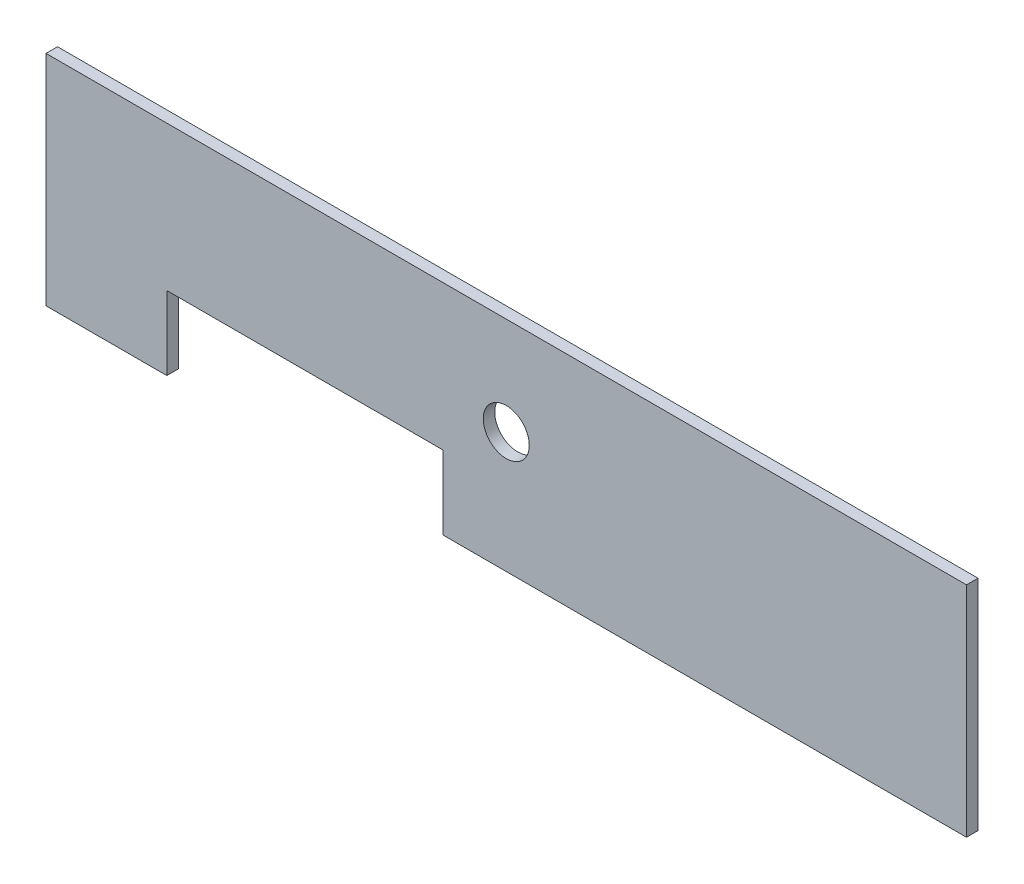
ISO-10303-21;
HEADER;
FILE_DESCRIPTION(('STEP AP214'),'2;1');
FILE_NAME('part.step','',(''),(''),'','','');
FILE_SCHEMA(('AUTOMOTIVE_DESIGN { 1 0 10303 214 1 1 1 1 }'));
ENDSEC;
DATA;
#1=APPLICATION_CONTEXT('core data for automotive mechanical design processes');
#2=APPLICATION_PROTOCOL_DEFINITION('international standard','automotive_design',2000,#1);
#3=PRODUCT_CONTEXT('',#1,'mechanical');
#4=PRODUCT('Part','Part','',(#3));
#5=PRODUCT_RELATED_PRODUCT_CATEGORY('part','',(#4));
#6=PRODUCT_DEFINITION_FORMATION('','',#4);
#7=PRODUCT_DEFINITION_CONTEXT('part definition',#1,'design');
#8=PRODUCT_DEFINITION('design','',#6,#7);
#9=PRODUCT_DEFINITION_SHAPE('','',#8);
#10=(LENGTH_UNIT() NAMED_UNIT(*) SI_UNIT(.MILLI.,.METRE.));
#11=(NAMED_UNIT(*) PLANE_ANGLE_UNIT() SI_UNIT($,.RADIAN.));
#12=(NAMED_UNIT(*) SI_UNIT($,.STERADIAN.) SOLID_ANGLE_UNIT());
#13=UNCERTAINTY_MEASURE_WITH_UNIT(LENGTH_MEASURE(1.E-05),#10,'distance_accuracy_value','');
#14=(GEOMETRIC_REPRESENTATION_CONTEXT(3) GLOBAL_UNCERTAINTY_ASSIGNED_CONTEXT((#13)) GLOBAL_UNIT_ASSIGNED_CONTEXT((#10,
#11,#12)) REPRESENTATION_CONTEXT('',''));
#15=CARTESIAN_POINT('',(0.,0.,0.));
#16=DIRECTION('',(0.,0.,1.));
#17=DIRECTION('',(1.,0.,0.));
#18=AXIS2_PLACEMENT_3D('',#15,#16,#17);
#19=CARTESIAN_POINT('',(-255.102040816327,148.567224711269,5.));
#20=DIRECTION('',(1.,0.,0.));
#21=DIRECTION('',(0.,1.,0.));
#22=AXIS2_PLACEMENT_3D('',#19,#20,#21);
#23=PLANE('',#22);
#24=DIRECTION('',(0.,-1.,0.));
#25=VECTOR('',#24,1.);
#26=CARTESIAN_POINT('',(-255.102040816327,148.567224711269,0.));
#27=LINE('',#26,#25);
#28=CARTESIAN_POINT('',(-255.102040816327,148.567224711269,0.));
#29=VERTEX_POINT('',#28);
#30=CARTESIAN_POINT('',(-255.102040816327,53.5672247112689,0.));
#31=VERTEX_POINT('',#30);
#32=EDGE_CURVE('E145',#29,#31,#27,.T.);
#33=ORIENTED_EDGE('',*,*,#32,.T.);
#34=DIRECTION('',(0.,0.,-1.));
#35=VECTOR('',#34,1.);
#36=CARTESIAN_POINT('',(-255.102040816327,53.5672247112689,5.));
#37=LINE('',#36,#35);
#38=CARTESIAN_POINT('',(-255.102040816327,53.5672247112689,5.));
#39=VERTEX_POINT('',#38);
#40=EDGE_CURVE('E11',#39,#31,#37,.T.);
#41=ORIENTED_EDGE('',*,*,#40,.F.);
#42=DIRECTION('',(0.,-1.,0.));
#43=VECTOR('',#42,1.);
#44=CARTESIAN_POINT('',(-255.102040816327,148.567224711269,5.));
#45=LINE('',#44,#43);
#46=CARTESIAN_POINT('',(-255.102040816327,148.567224711269,5.));
#47=VERTEX_POINT('',#46);
#48=EDGE_CURVE('E160',#47,#39,#45,.T.);
#49=ORIENTED_EDGE('',*,*,#48,.F.);
#50=DIRECTION('',(0.,0.,-1.));
#51=VECTOR('',#50,1.);
#52=CARTESIAN_POINT('',(-255.102040816327,148.567224711269,5.));
#53=LINE('',#52,#51);
#54=EDGE_CURVE('E141',#47,#29,#53,.T.);
#55=ORIENTED_EDGE('',*,*,#54,.T.);
#56=EDGE_LOOP('',(#33,#41,#49,#55));
#57=FACE_BOUND('',#56,.T.);
#58=ADVANCED_FACE('F49',(#57),#23,.F.);
#59=CARTESIAN_POINT('',(-255.102040816327,53.5672247112689,5.));
#60=DIRECTION('',(0.,1.,0.));
#61=DIRECTION('',(-1.,0.,0.));
#62=AXIS2_PLACEMENT_3D('',#59,#60,#61);
#63=PLANE('',#62);
#64=DIRECTION('',(1.,0.,0.));
#65=VECTOR('',#64,1.);
#66=CARTESIAN_POINT('',(-255.102040816327,53.5672247112689,0.));
#67=LINE('',#66,#65);
#68=CARTESIAN_POINT('',(-202.602040816327,53.567224711269,0.));
#69=VERTEX_POINT('',#68);
#70=EDGE_CURVE('E148',#31,#69,#67,.T.);
#71=ORIENTED_EDGE('',*,*,#70,.T.);
#72=DIRECTION('',(0.,0.,-1.));
#73=VECTOR('',#72,1.);
#74=CARTESIAN_POINT('',(-202.602040816327,53.567224711269,5.));
#75=LINE('',#74,#73);
#76=CARTESIAN_POINT('',(-202.602040816327,53.567224711269,5.));
#77=VERTEX_POINT('',#76);
#78=EDGE_CURVE('E58',#77,#69,#75,.T.);
#79=ORIENTED_EDGE('',*,*,#78,.F.);
#80=DIRECTION('',(1.,0.,0.));
#81=VECTOR('',#80,1.);
#82=CARTESIAN_POINT('',(-255.102040816327,53.5672247112689,5.));
#83=LINE('',#82,#81);
#84=EDGE_CURVE('E109',#39,#77,#83,.T.);
#85=ORIENTED_EDGE('',*,*,#84,.F.);
#86=ORIENTED_EDGE('',*,*,#40,.T.);
#87=EDGE_LOOP('',(#71,#79,#85,#86));
#88=FACE_BOUND('',#87,.T.);
#89=ADVANCED_FACE('F211',(#88),#63,.F.);
#90=CARTESIAN_POINT('',(-202.602040816326,85.5672247112689,5.));
#91=DIRECTION('',(-1.,0.,0.));
#92=DIRECTION('',(0.,-1.,0.));
#93=AXIS2_PLACEMENT_3D('',#90,#91,#92);
#94=PLANE('',#93);
#95=DIRECTION('',(0.,1.,0.));
#96=VECTOR('',#95,1.);
#97=CARTESIAN_POINT('',(-202.602040816326,85.5672247112689,0.));
#98=LINE('',#97,#96);
#99=CARTESIAN_POINT('',(-202.602040816326,85.5672247112689,0.));
#100=VERTEX_POINT('',#99);
#101=EDGE_CURVE('E150',#69,#100,#98,.T.);
#102=ORIENTED_EDGE('',*,*,#101,.T.);
#103=DIRECTION('',(0.,0.,-1.));
#104=VECTOR('',#103,1.);
#105=CARTESIAN_POINT('',(-202.602040816326,85.5672247112689,5.));
#106=LINE('',#105,#104);
#107=CARTESIAN_POINT('',(-202.602040816326,85.5672247112689,5.));
#108=VERTEX_POINT('',#107);
#109=EDGE_CURVE('E167',#108,#100,#106,.T.);
#110=ORIENTED_EDGE('',*,*,#109,.F.);
#111=DIRECTION('',(0.,1.,0.));
#112=VECTOR('',#111,1.);
#113=CARTESIAN_POINT('',(-202.602040816326,85.5672247112689,5.));
#114=LINE('',#113,#112);
#115=EDGE_CURVE('E176',#77,#108,#114,.T.);
#116=ORIENTED_EDGE('',*,*,#115,.F.);
#117=ORIENTED_EDGE('',*,*,#78,.T.);
#118=EDGE_LOOP('',(#102,#110,#116,#117));
#119=FACE_BOUND('',#118,.T.);
#120=ADVANCED_FACE('F174',(#119),#94,.F.);
#121=CARTESIAN_POINT('',(-82.6020408163265,85.5672247112689,5.));
#122=DIRECTION('',(0.,1.,0.));
#123=DIRECTION('',(-1.,0.,0.));
#124=AXIS2_PLACEMENT_3D('',#121,#122,#123);
#125=PLANE('',#124);
#126=DIRECTION('',(1.,0.,0.));
#127=VECTOR('',#126,1.);
#128=CARTESIAN_POINT('',(-82.6020408163265,85.5672247112689,0.));
#129=LINE('',#128,#127);
#130=CARTESIAN_POINT('',(-82.6020408163265,85.5672247112689,0.));
#131=VERTEX_POINT('',#130);
#132=EDGE_CURVE('E152',#100,#131,#129,.T.);
#133=ORIENTED_EDGE('',*,*,#132,.T.);
#134=DIRECTION('',(0.,0.,-1.));
#135=VECTOR('',#134,1.);
#136=CARTESIAN_POINT('',(-82.6020408163265,85.5672247112689,5.));
#137=LINE('',#136,#135);
#138=CARTESIAN_POINT('',(-82.6020408163265,85.5672247112689,5.));
#139=VERTEX_POINT('',#138);
#140=EDGE_CURVE('E164',#139,#131,#137,.T.);
#141=ORIENTED_EDGE('',*,*,#140,.F.);
#142=DIRECTION('',(1.,0.,0.));
#143=VECTOR('',#142,1.);
#144=CARTESIAN_POINT('',(-82.6020408163265,85.5672247112689,5.));
#145=LINE('',#144,#143);
#146=EDGE_CURVE('E188',#108,#139,#145,.T.);
#147=ORIENTED_EDGE('',*,*,#146,.F.);
#148=ORIENTED_EDGE('',*,*,#109,.T.);
#149=EDGE_LOOP('',(#133,#141,#147,#148));
#150=FACE_BOUND('',#149,.T.);
#151=ADVANCED_FACE('F184',(#150),#125,.F.);
#152=CARTESIAN_POINT('',(-82.6020408163265,85.5672247112689,5.));
#153=DIRECTION('',(1.,0.,0.));
#154=DIRECTION('',(0.,1.,0.));
#155=AXIS2_PLACEMENT_3D('',#152,#153,#154);
#156=PLANE('',#155);
#157=DIRECTION('',(0.,-1.,0.));
#158=VECTOR('',#157,1.);
#159=CARTESIAN_POINT('',(-82.6020408163265,85.5672247112689,0.));
#160=LINE('',#159,#158);
#161=CARTESIAN_POINT('',(-82.6020408163266,53.567224711269,0.));
#162=VERTEX_POINT('',#161);
#163=EDGE_CURVE('E154',#131,#162,#160,.T.);
#164=ORIENTED_EDGE('',*,*,#163,.T.);
#165=DIRECTION('',(0.,0.,-1.));
#166=VECTOR('',#165,1.);
#167=CARTESIAN_POINT('',(-82.6020408163266,53.567224711269,5.));
#168=LINE('',#167,#166);
#169=CARTESIAN_POINT('',(-82.6020408163266,53.567224711269,5.));
#170=VERTEX_POINT('',#169);
#171=EDGE_CURVE('E136',#170,#162,#168,.T.);
#172=ORIENTED_EDGE('',*,*,#171,.F.);
#173=DIRECTION('',(0.,-1.,0.));
#174=VECTOR('',#173,1.);
#175=CARTESIAN_POINT('',(-82.6020408163265,85.5672247112689,5.));
#176=LINE('',#175,#174);
#177=EDGE_CURVE('E128',#139,#170,#176,.T.);
#178=ORIENTED_EDGE('',*,*,#177,.F.);
#179=ORIENTED_EDGE('',*,*,#140,.T.);
#180=EDGE_LOOP('',(#164,#172,#178,#179));
#181=FACE_BOUND('',#180,.T.);
#182=ADVANCED_FACE('F187',(#181),#156,.F.);
#183=CARTESIAN_POINT('',(92.3979591836735,53.5672247112689,5.));
#184=DIRECTION('',(0.,1.,0.));
#185=DIRECTION('',(0.,0.,1.));
#186=AXIS2_PLACEMENT_3D('',#183,#184,#185);
#187=PLANE('',#186);
#188=DIRECTION('',(1.,0.,0.));
#189=VECTOR('',#188,1.);
#190=CARTESIAN_POINT('',(92.3979591836735,53.5672247112689,0.));
#191=LINE('',#190,#189);
#192=CARTESIAN_POINT('',(144.897959183673,53.5672247112689,0.));
#193=VERTEX_POINT('',#192);
#194=EDGE_CURVE('E135',#162,#193,#191,.T.);
#195=ORIENTED_EDGE('',*,*,#194,.T.);
#196=DIRECTION('',(0.,0.,-1.));
#197=VECTOR('',#196,1.);
#198=CARTESIAN_POINT('',(144.897959183673,53.5672247112689,5.));
#199=LINE('',#198,#197);
#200=CARTESIAN_POINT('',(144.897959183673,53.5672247112689,5.));
#201=VERTEX_POINT('',#200);
#202=EDGE_CURVE('E133',#201,#193,#199,.T.);
#203=ORIENTED_EDGE('',*,*,#202,.F.);
#204=DIRECTION('',(1.,0.,0.));
#205=VECTOR('',#204,1.);
#206=CARTESIAN_POINT('',(-82.6020408163266,53.567224711269,5.));
#207=LINE('',#206,#205);
#208=EDGE_CURVE('E122',#170,#201,#207,.T.);
#209=ORIENTED_EDGE('',*,*,#208,.F.);
#210=ORIENTED_EDGE('',*,*,#171,.T.);
#211=EDGE_LOOP('',(#195,#203,#209,#210));
#212=FACE_BOUND('',#211,.T.);
#213=ADVANCED_FACE('F134',(#212),#187,.F.);
#214=CARTESIAN_POINT('',(144.897959183673,148.567224711269,5.));
#215=DIRECTION('',(-1.,0.,0.));
#216=DIRECTION('',(0.,0.,1.));
#217=AXIS2_PLACEMENT_3D('',#214,#215,#216);
#218=PLANE('',#217);
#219=DIRECTION('',(0.,1.,0.));
#220=VECTOR('',#219,1.);
#221=CARTESIAN_POINT('',(144.897959183673,148.567224711269,0.));
#222=LINE('',#221,#220);
#223=CARTESIAN_POINT('',(144.897959183673,148.567224711269,0.));
#224=VERTEX_POINT('',#223);
#225=EDGE_CURVE('E95',#193,#224,#222,.T.);
#226=ORIENTED_EDGE('',*,*,#225,.T.);
#227=DIRECTION('',(0.,0.,-1.));
#228=VECTOR('',#227,1.);
#229=CARTESIAN_POINT('',(144.897959183673,148.567224711269,5.));
#230=LINE('',#229,#228);
#231=CARTESIAN_POINT('',(144.897959183673,148.567224711269,5.));
#232=VERTEX_POINT('',#231);
#233=EDGE_CURVE('E137',#232,#224,#230,.T.);
#234=ORIENTED_EDGE('',*,*,#233,.F.);
#235=DIRECTION('',(0.,1.,0.));
#236=VECTOR('',#235,1.);
#237=CARTESIAN_POINT('',(144.897959183673,148.567224711269,5.));
#238=LINE('',#237,#236);
#239=EDGE_CURVE('E126',#201,#232,#238,.T.);
#240=ORIENTED_EDGE('',*,*,#239,.F.);
#241=ORIENTED_EDGE('',*,*,#202,.T.);
#242=EDGE_LOOP('',(#226,#234,#240,#241));
#243=FACE_BOUND('',#242,.T.);
#244=ADVANCED_FACE('F139',(#243),#218,.F.);
#245=CARTESIAN_POINT('',(-255.102040816327,148.567224711269,5.));
#246=DIRECTION('',(0.,-1.,0.));
#247=DIRECTION('',(0.,0.,-1.));
#248=AXIS2_PLACEMENT_3D('',#245,#246,#247);
#249=PLANE('',#248);
#250=DIRECTION('',(-1.,0.,0.));
#251=VECTOR('',#250,1.);
#252=CARTESIAN_POINT('',(-255.102040816327,148.567224711269,0.));
#253=LINE('',#252,#251);
#254=EDGE_CURVE('E101',#224,#29,#253,.T.);
#255=ORIENTED_EDGE('',*,*,#254,.T.);
#256=ORIENTED_EDGE('',*,*,#54,.F.);
#257=DIRECTION('',(-1.,0.,0.));
#258=VECTOR('',#257,1.);
#259=CARTESIAN_POINT('',(-255.102040816327,148.567224711269,5.));
#260=LINE('',#259,#258);
#261=EDGE_CURVE('E66',#232,#47,#260,.T.);
#262=ORIENTED_EDGE('',*,*,#261,.F.);
#263=ORIENTED_EDGE('',*,*,#233,.T.);
#264=EDGE_LOOP('',(#255,#256,#262,#263));
#265=FACE_BOUND('',#264,.T.);
#266=ADVANCED_FACE('F218',(#265),#249,.F.);
#267=CARTESIAN_POINT('',(0.,0.,5.));
#268=DIRECTION('',(0.,0.,1.));
#269=DIRECTION('',(1.,0.,0.));
#270=AXIS2_PLACEMENT_3D('',#267,#268,#269);
#271=PLANE('',#270);
#272=CARTESIAN_POINT('',(-55.1020408163265,106.067224711269,5.));
#273=DIRECTION('',(0.,0.,1.));
#274=DIRECTION('',(1.,0.,0.));
#275=AXIS2_PLACEMENT_3D('',#272,#273,#274);
#276=CIRCLE('',#275,10.);
#277=CARTESIAN_POINT('',(-45.1020408163265,106.067224711269,5.));
#278=VERTEX_POINT('',#277);
#279=EDGE_CURVE('E194',#278,#278,#276,.T.);
#280=ORIENTED_EDGE('',*,*,#279,.F.);
#281=EDGE_LOOP('',(#280));
#282=FACE_BOUND('',#281,.T.);
#283=ORIENTED_EDGE('',*,*,#48,.T.);
#284=ORIENTED_EDGE('',*,*,#84,.T.);
#285=ORIENTED_EDGE('',*,*,#115,.T.);
#286=ORIENTED_EDGE('',*,*,#146,.T.);
#287=ORIENTED_EDGE('',*,*,#177,.T.);
#288=ORIENTED_EDGE('',*,*,#208,.T.);
#289=ORIENTED_EDGE('',*,*,#239,.T.);
#290=ORIENTED_EDGE('',*,*,#261,.T.);
#291=EDGE_LOOP('',(#283,#284,#285,#286,#287,#288,#289,#290));
#292=FACE_BOUND('',#291,.T.);
#293=ADVANCED_FACE('F124',(#282,#292),#271,.T.);
#294=CARTESIAN_POINT('',(0.,0.,0.));
#295=DIRECTION('',(0.,0.,1.));
#296=DIRECTION('',(1.,0.,0.));
#297=AXIS2_PLACEMENT_3D('',#294,#295,#296);
#298=PLANE('',#297);
#299=CARTESIAN_POINT('',(-55.1020408163265,106.067224711269,0.));
#300=DIRECTION('',(0.,0.,1.));
#301=DIRECTION('',(1.,0.,0.));
#302=AXIS2_PLACEMENT_3D('',#299,#300,#301);
#303=CIRCLE('',#302,10.);
#304=CARTESIAN_POINT('',(-45.1020408163265,106.067224711269,0.));
#305=VERTEX_POINT('',#304);
#306=EDGE_CURVE('E52',#305,#305,#303,.T.);
#307=ORIENTED_EDGE('',*,*,#306,.T.);
#308=EDGE_LOOP('',(#307));
#309=FACE_BOUND('',#308,.T.);
#310=ORIENTED_EDGE('',*,*,#32,.F.);
#311=ORIENTED_EDGE('',*,*,#254,.F.);
#312=ORIENTED_EDGE('',*,*,#225,.F.);
#313=ORIENTED_EDGE('',*,*,#194,.F.);
#314=ORIENTED_EDGE('',*,*,#163,.F.);
#315=ORIENTED_EDGE('',*,*,#132,.F.);
#316=ORIENTED_EDGE('',*,*,#101,.F.);
#317=ORIENTED_EDGE('',*,*,#70,.F.);
#318=EDGE_LOOP('',(#310,#311,#312,#313,#314,#315,#316,#317));
#319=FACE_BOUND('',#318,.T.);
#320=ADVANCED_FACE('F180',(#309,#319),#298,.F.);
#321=CARTESIAN_POINT('',(-55.1020408163265,106.067224711269,-5.));
#322=DIRECTION('',(0.,0.,1.));
#323=DIRECTION('',(1.,0.,0.));
#324=AXIS2_PLACEMENT_3D('',#321,#322,#323);
#325=CYLINDRICAL_SURFACE('',#324,10.);
#326=ORIENTED_EDGE('',*,*,#279,.T.);
#327=EDGE_LOOP('',(#326));
#328=FACE_BOUND('',#327,.T.);
#329=ORIENTED_EDGE('',*,*,#306,.F.);
#330=EDGE_LOOP('',(#329));
#331=FACE_BOUND('',#330,.T.);
#332=ADVANCED_FACE('F202',(#328,#331),#325,.F.);
#333=CLOSED_SHELL('',(#58,#89,#120,#151,#182,#213,#244,#266,#293,#320,#332));
#334=MANIFOLD_SOLID_BREP('B2',#333);
#335=ADVANCED_BREP_SHAPE_REPRESENTATION('',(#18,#334),#14);
#336=SHAPE_DEFINITION_REPRESENTATION(#9,#335);
ENDSEC;
END-ISO-10303-21;
